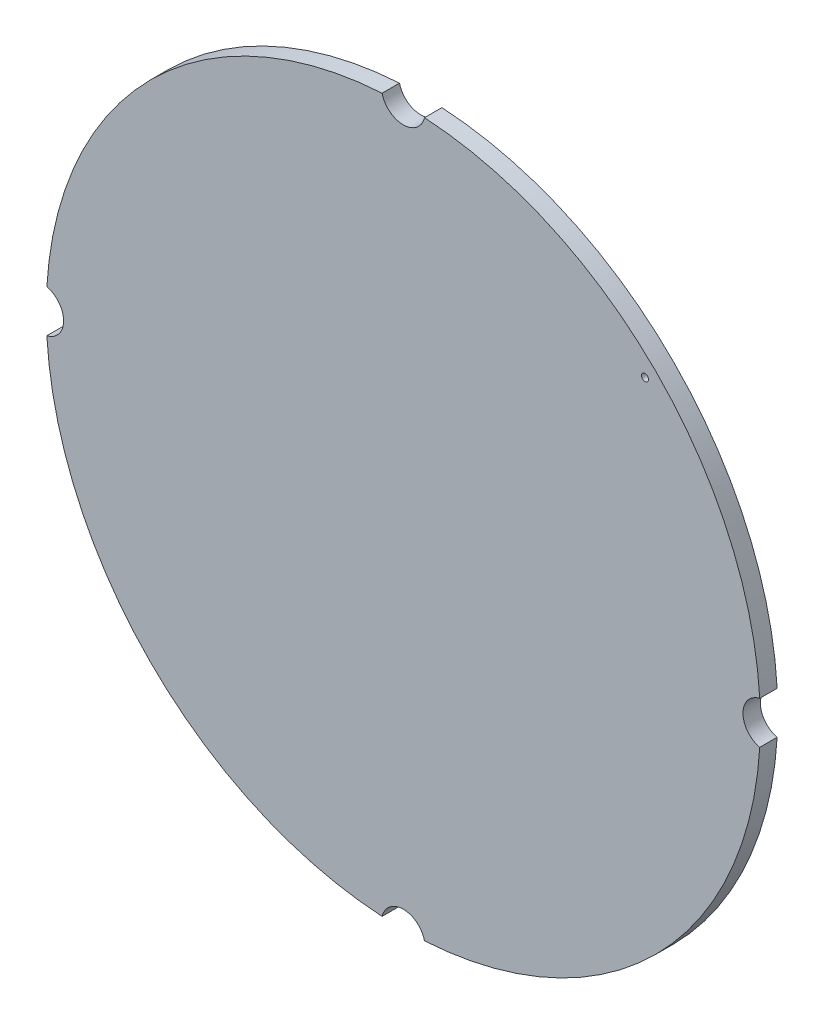
ISO-10303-21;
HEADER;
FILE_DESCRIPTION(('STEP AP214'),'2;1');
FILE_NAME('part.step','',(''),(''),'','','');
FILE_SCHEMA(('AUTOMOTIVE_DESIGN { 1 0 10303 214 1 1 1 1 }'));
ENDSEC;
DATA;
#1=APPLICATION_CONTEXT('core data for automotive mechanical design processes');
#2=APPLICATION_PROTOCOL_DEFINITION('international standard','automotive_design',2000,#1);
#3=PRODUCT_CONTEXT('',#1,'mechanical');
#4=PRODUCT('Part','Part','',(#3));
#5=PRODUCT_RELATED_PRODUCT_CATEGORY('part','',(#4));
#6=PRODUCT_DEFINITION_FORMATION('','',#4);
#7=PRODUCT_DEFINITION_CONTEXT('part definition',#1,'design');
#8=PRODUCT_DEFINITION('design','',#6,#7);
#9=PRODUCT_DEFINITION_SHAPE('','',#8);
#10=(LENGTH_UNIT() NAMED_UNIT(*) SI_UNIT(.MILLI.,.METRE.));
#11=(NAMED_UNIT(*) PLANE_ANGLE_UNIT() SI_UNIT($,.RADIAN.));
#12=(NAMED_UNIT(*) SI_UNIT($,.STERADIAN.) SOLID_ANGLE_UNIT());
#13=UNCERTAINTY_MEASURE_WITH_UNIT(LENGTH_MEASURE(1.E-05),#10,'distance_accuracy_value','');
#14=(GEOMETRIC_REPRESENTATION_CONTEXT(3) GLOBAL_UNCERTAINTY_ASSIGNED_CONTEXT((#13)) GLOBAL_UNIT_ASSIGNED_CONTEXT((#10,
#11,#12)) REPRESENTATION_CONTEXT('',''));
#15=CARTESIAN_POINT('',(0.,0.,0.));
#16=DIRECTION('',(0.,0.,1.));
#17=DIRECTION('',(1.,0.,0.));
#18=AXIS2_PLACEMENT_3D('',#15,#16,#17);
#19=CARTESIAN_POINT('',(0.,0.,3.));
#20=DIRECTION('',(0.,0.,-1.));
#21=DIRECTION('',(-1.,0.,0.));
#22=AXIS2_PLACEMENT_3D('',#19,#20,#21);
#23=CYLINDRICAL_SURFACE('',#22,82.);
#24=CARTESIAN_POINT('',(0.,0.,0.));
#25=DIRECTION('',(0.,0.,1.));
#26=DIRECTION('',(1.,0.,0.));
#27=AXIS2_PLACEMENT_3D('',#24,#25,#26);
#28=CIRCLE('',#27,82.);
#29=CARTESIAN_POINT('',(-4.86723129559619,81.855421686747,0.));
#30=VERTEX_POINT('',#29);
#31=CARTESIAN_POINT('',(-81.8554216867469,4.86723129559704,0.));
#32=VERTEX_POINT('',#31);
#33=EDGE_CURVE('E11',#30,#32,#28,.T.);
#34=ORIENTED_EDGE('',*,*,#33,.T.);
#35=DIRECTION('',(0.,0.,-1.));
#36=VECTOR('',#35,1.);
#37=CARTESIAN_POINT('',(-81.8554216867469,4.86723129559704,2.));
#38=LINE('',#37,#36);
#39=CARTESIAN_POINT('',(-81.8554216867469,4.86723129559704,4.));
#40=VERTEX_POINT('',#39);
#41=EDGE_CURVE('E102',#32,#40,#38,.F.);
#42=ORIENTED_EDGE('',*,*,#41,.T.);
#43=CARTESIAN_POINT('',(0.,0.,4.));
#44=DIRECTION('',(0.,0.,1.));
#45=DIRECTION('',(1.,0.,0.));
#46=AXIS2_PLACEMENT_3D('',#43,#44,#45);
#47=CIRCLE('',#46,82.);
#48=CARTESIAN_POINT('',(-4.86723129559619,81.855421686747,4.));
#49=VERTEX_POINT('',#48);
#50=EDGE_CURVE('E112',#49,#40,#47,.T.);
#51=ORIENTED_EDGE('',*,*,#50,.F.);
#52=DIRECTION('',(0.,0.,-1.));
#53=VECTOR('',#52,1.);
#54=CARTESIAN_POINT('',(-4.86723129559619,81.855421686747,2.));
#55=LINE('',#54,#53);
#56=EDGE_CURVE('E133',#49,#30,#55,.T.);
#57=ORIENTED_EDGE('',*,*,#56,.T.);
#58=EDGE_LOOP('',(#34,#42,#51,#57));
#59=FACE_BOUND('',#58,.T.);
#60=ADVANCED_FACE('F35',(#59),#23,.T.);
#61=CARTESIAN_POINT('',(-81.8554216867471,-4.86723129559533,4.));
#62=VERTEX_POINT('',#61);
#63=CARTESIAN_POINT('',(-4.86723129559619,-81.855421686747,4.));
#64=VERTEX_POINT('',#63);
#65=EDGE_CURVE('E121',#62,#64,#47,.T.);
#66=ORIENTED_EDGE('',*,*,#65,.F.);
#67=DIRECTION('',(0.,0.,-1.));
#68=VECTOR('',#67,1.);
#69=CARTESIAN_POINT('',(-81.8554216867471,-4.86723129559533,2.));
#70=LINE('',#69,#68);
#71=CARTESIAN_POINT('',(-81.8554216867471,-4.86723129559533,0.));
#72=VERTEX_POINT('',#71);
#73=EDGE_CURVE('E51',#62,#72,#70,.T.);
#74=ORIENTED_EDGE('',*,*,#73,.T.);
#75=CARTESIAN_POINT('',(-4.86723129559619,-81.855421686747,0.));
#76=VERTEX_POINT('',#75);
#77=EDGE_CURVE('E43',#72,#76,#28,.T.);
#78=ORIENTED_EDGE('',*,*,#77,.T.);
#79=DIRECTION('',(0.,0.,-1.));
#80=VECTOR('',#79,1.);
#81=CARTESIAN_POINT('',(-4.86723129559619,-81.855421686747,2.));
#82=LINE('',#81,#80);
#83=EDGE_CURVE('E150',#76,#64,#82,.F.);
#84=ORIENTED_EDGE('',*,*,#83,.T.);
#85=EDGE_LOOP('',(#66,#74,#78,#84));
#86=FACE_BOUND('',#85,.T.);
#87=ADVANCED_FACE('F186',(#86),#23,.T.);
#88=CARTESIAN_POINT('',(4.86723129559619,-81.855421686747,4.));
#89=VERTEX_POINT('',#88);
#90=CARTESIAN_POINT('',(81.855421686747,-4.86723129559647,4.));
#91=VERTEX_POINT('',#90);
#92=EDGE_CURVE('E127',#89,#91,#47,.T.);
#93=ORIENTED_EDGE('',*,*,#92,.F.);
#94=DIRECTION('',(0.,0.,-1.));
#95=VECTOR('',#94,1.);
#96=CARTESIAN_POINT('',(4.86723129559619,-81.855421686747,2.));
#97=LINE('',#96,#95);
#98=CARTESIAN_POINT('',(4.86723129559619,-81.855421686747,0.));
#99=VERTEX_POINT('',#98);
#100=EDGE_CURVE('E59',#89,#99,#97,.T.);
#101=ORIENTED_EDGE('',*,*,#100,.T.);
#102=CARTESIAN_POINT('',(81.855421686747,-4.86723129559647,0.));
#103=VERTEX_POINT('',#102);
#104=EDGE_CURVE('E216',#99,#103,#28,.T.);
#105=ORIENTED_EDGE('',*,*,#104,.T.);
#106=DIRECTION('',(0.,0.,-1.));
#107=VECTOR('',#106,1.);
#108=CARTESIAN_POINT('',(81.855421686747,-4.86723129559647,2.));
#109=LINE('',#108,#107);
#110=EDGE_CURVE('E140',#103,#91,#109,.F.);
#111=ORIENTED_EDGE('',*,*,#110,.T.);
#112=EDGE_LOOP('',(#93,#101,#105,#111));
#113=FACE_BOUND('',#112,.T.);
#114=ADVANCED_FACE('F190',(#113),#23,.T.);
#115=CARTESIAN_POINT('',(0.,0.,0.));
#116=DIRECTION('',(0.,0.,1.));
#117=DIRECTION('',(1.,0.,0.));
#118=AXIS2_PLACEMENT_3D('',#115,#116,#117);
#119=PLANE('',#118);
#120=CARTESIAN_POINT('',(55.507882323144,55.507882323144,0.));
#121=DIRECTION('',(0.,0.,1.));
#122=DIRECTION('',(1.,0.,0.));
#123=AXIS2_PLACEMENT_3D('',#120,#121,#122);
#124=CIRCLE('',#123,0.800000000000002);
#125=CARTESIAN_POINT('',(56.307882323144,55.507882323144,0.));
#126=VERTEX_POINT('',#125);
#127=EDGE_CURVE('E159',#126,#126,#124,.T.);
#128=ORIENTED_EDGE('',*,*,#127,.T.);
#129=EDGE_LOOP('',(#128));
#130=FACE_BOUND('',#129,.T.);
#131=ORIENTED_EDGE('',*,*,#77,.F.);
#132=CARTESIAN_POINT('',(-83.,8.6937885337194E-13,0.));
#133=DIRECTION('',(0.,0.,-1.));
#134=DIRECTION('',(0.,-1.,0.));
#135=AXIS2_PLACEMENT_3D('',#132,#133,#134);
#136=CIRCLE('',#135,5.);
#137=EDGE_CURVE('E107',#32,#72,#136,.T.);
#138=ORIENTED_EDGE('',*,*,#137,.F.);
#139=ORIENTED_EDGE('',*,*,#33,.F.);
#140=CARTESIAN_POINT('',(0.,83.,0.));
#141=DIRECTION('',(0.,0.,-1.));
#142=DIRECTION('',(-1.,0.,0.));
#143=AXIS2_PLACEMENT_3D('',#140,#141,#142);
#144=CIRCLE('',#143,5.);
#145=CARTESIAN_POINT('',(4.86723129559619,81.855421686747,0.));
#146=VERTEX_POINT('',#145);
#147=EDGE_CURVE('E138',#146,#30,#144,.T.);
#148=ORIENTED_EDGE('',*,*,#147,.F.);
#149=CARTESIAN_POINT('',(81.855421686747,4.8672312955959,0.));
#150=VERTEX_POINT('',#149);
#151=EDGE_CURVE('E44',#150,#146,#28,.T.);
#152=ORIENTED_EDGE('',*,*,#151,.F.);
#153=CARTESIAN_POINT('',(83.,-2.8979295112398E-13,0.));
#154=DIRECTION('',(0.,0.,-1.));
#155=DIRECTION('',(0.,1.,0.));
#156=AXIS2_PLACEMENT_3D('',#153,#154,#155);
#157=CIRCLE('',#156,5.);
#158=EDGE_CURVE('E148',#103,#150,#157,.T.);
#159=ORIENTED_EDGE('',*,*,#158,.F.);
#160=ORIENTED_EDGE('',*,*,#104,.F.);
#161=CARTESIAN_POINT('',(0.,-83.,0.));
#162=DIRECTION('',(0.,0.,-1.));
#163=DIRECTION('',(1.,0.,0.));
#164=AXIS2_PLACEMENT_3D('',#161,#162,#163);
#165=CIRCLE('',#164,5.);
#166=EDGE_CURVE('E114',#76,#99,#165,.T.);
#167=ORIENTED_EDGE('',*,*,#166,.F.);
#168=EDGE_LOOP('',(#131,#138,#139,#148,#152,#159,#160,#167));
#169=FACE_BOUND('',#168,.T.);
#170=CARTESIAN_POINT('',(0.,0.,0.));
#171=DIRECTION('',(0.,0.,1.));
#172=DIRECTION('',(1.,0.,0.));
#173=AXIS2_PLACEMENT_3D('',#170,#171,#172);
#174=CIRCLE('',#173,75.);
#175=CARTESIAN_POINT('',(75.,0.,0.));
#176=VERTEX_POINT('',#175);
#177=EDGE_CURVE('E125',#176,#176,#174,.T.);
#178=ORIENTED_EDGE('',*,*,#177,.T.);
#179=EDGE_LOOP('',(#178));
#180=FACE_BOUND('',#179,.T.);
#181=ADVANCED_FACE('F193',(#130,#169,#180),#119,.F.);
#182=CARTESIAN_POINT('',(81.855421686747,4.86723129559591,4.));
#183=VERTEX_POINT('',#182);
#184=CARTESIAN_POINT('',(4.86723129559619,81.855421686747,4.));
#185=VERTEX_POINT('',#184);
#186=EDGE_CURVE('E123',#183,#185,#47,.T.);
#187=ORIENTED_EDGE('',*,*,#186,.F.);
#188=DIRECTION('',(0.,0.,-1.));
#189=VECTOR('',#188,1.);
#190=CARTESIAN_POINT('',(81.855421686747,4.8672312955959,2.));
#191=LINE('',#190,#189);
#192=EDGE_CURVE('E144',#183,#150,#191,.T.);
#193=ORIENTED_EDGE('',*,*,#192,.T.);
#194=ORIENTED_EDGE('',*,*,#151,.T.);
#195=DIRECTION('',(0.,0.,-1.));
#196=VECTOR('',#195,1.);
#197=CARTESIAN_POINT('',(4.86723129559619,81.855421686747,2.));
#198=LINE('',#197,#196);
#199=EDGE_CURVE('E129',#146,#185,#198,.F.);
#200=ORIENTED_EDGE('',*,*,#199,.T.);
#201=EDGE_LOOP('',(#187,#193,#194,#200));
#202=FACE_BOUND('',#201,.T.);
#203=ADVANCED_FACE('F37',(#202),#23,.T.);
#204=CARTESIAN_POINT('',(0.,0.,3.));
#205=DIRECTION('',(0.,0.,-1.));
#206=DIRECTION('',(-1.,0.,0.));
#207=AXIS2_PLACEMENT_3D('',#204,#205,#206);
#208=CYLINDRICAL_SURFACE('',#207,75.);
#209=CARTESIAN_POINT('',(0.,0.,3.));
#210=DIRECTION('',(0.,0.,1.));
#211=DIRECTION('',(1.,0.,0.));
#212=AXIS2_PLACEMENT_3D('',#209,#210,#211);
#213=CIRCLE('',#212,75.);
#214=CARTESIAN_POINT('',(75.,0.,3.));
#215=VERTEX_POINT('',#214);
#216=EDGE_CURVE('E120',#215,#215,#213,.T.);
#217=ORIENTED_EDGE('',*,*,#216,.T.);
#218=EDGE_LOOP('',(#217));
#219=FACE_BOUND('',#218,.T.);
#220=ORIENTED_EDGE('',*,*,#177,.F.);
#221=EDGE_LOOP('',(#220));
#222=FACE_BOUND('',#221,.T.);
#223=ADVANCED_FACE('F182',(#219,#222),#208,.F.);
#224=CARTESIAN_POINT('',(0.,0.,3.));
#225=DIRECTION('',(0.,0.,1.));
#226=DIRECTION('',(1.,0.,0.));
#227=AXIS2_PLACEMENT_3D('',#224,#225,#226);
#228=PLANE('',#227);
#229=ORIENTED_EDGE('',*,*,#216,.F.);
#230=EDGE_LOOP('',(#229));
#231=FACE_BOUND('',#230,.T.);
#232=ADVANCED_FACE('F171',(#231),#228,.F.);
#233=CARTESIAN_POINT('',(0.,0.,4.));
#234=DIRECTION('',(0.,0.,1.));
#235=DIRECTION('',(1.,0.,0.));
#236=AXIS2_PLACEMENT_3D('',#233,#234,#235);
#237=PLANE('',#236);
#238=CARTESIAN_POINT('',(55.507882323144,55.507882323144,4.));
#239=DIRECTION('',(0.,0.,1.));
#240=DIRECTION('',(1.,0.,0.));
#241=AXIS2_PLACEMENT_3D('',#238,#239,#240);
#242=CIRCLE('',#241,0.799999999999988);
#243=CARTESIAN_POINT('',(56.307882323144,55.507882323144,4.));
#244=VERTEX_POINT('',#243);
#245=EDGE_CURVE('E163',#244,#244,#242,.T.);
#246=ORIENTED_EDGE('',*,*,#245,.F.);
#247=EDGE_LOOP('',(#246));
#248=FACE_BOUND('',#247,.T.);
#249=CARTESIAN_POINT('',(-83.,8.6937885337194E-13,4.));
#250=DIRECTION('',(0.,0.,-1.));
#251=DIRECTION('',(0.,-1.,0.));
#252=AXIS2_PLACEMENT_3D('',#249,#250,#251);
#253=CIRCLE('',#252,5.);
#254=EDGE_CURVE('E99',#40,#62,#253,.T.);
#255=ORIENTED_EDGE('',*,*,#254,.T.);
#256=ORIENTED_EDGE('',*,*,#65,.T.);
#257=CARTESIAN_POINT('',(0.,-83.,4.));
#258=DIRECTION('',(0.,0.,-1.));
#259=DIRECTION('',(1.,0.,0.));
#260=AXIS2_PLACEMENT_3D('',#257,#258,#259);
#261=CIRCLE('',#260,5.);
#262=EDGE_CURVE('E155',#64,#89,#261,.T.);
#263=ORIENTED_EDGE('',*,*,#262,.T.);
#264=ORIENTED_EDGE('',*,*,#92,.T.);
#265=CARTESIAN_POINT('',(83.,-2.8979295112398E-13,4.));
#266=DIRECTION('',(0.,0.,-1.));
#267=DIRECTION('',(0.,1.,0.));
#268=AXIS2_PLACEMENT_3D('',#265,#266,#267);
#269=CIRCLE('',#268,5.);
#270=EDGE_CURVE('E147',#91,#183,#269,.T.);
#271=ORIENTED_EDGE('',*,*,#270,.T.);
#272=ORIENTED_EDGE('',*,*,#186,.T.);
#273=CARTESIAN_POINT('',(0.,83.,4.));
#274=DIRECTION('',(0.,0.,-1.));
#275=DIRECTION('',(-1.,0.,0.));
#276=AXIS2_PLACEMENT_3D('',#273,#274,#275);
#277=CIRCLE('',#276,5.);
#278=EDGE_CURVE('E119',#185,#49,#277,.T.);
#279=ORIENTED_EDGE('',*,*,#278,.T.);
#280=ORIENTED_EDGE('',*,*,#50,.T.);
#281=EDGE_LOOP('',(#255,#256,#263,#264,#271,#272,#279,#280));
#282=FACE_BOUND('',#281,.T.);
#283=ADVANCED_FACE('F117',(#248,#282),#237,.T.);
#284=CARTESIAN_POINT('',(0.,83.,4.));
#285=DIRECTION('',(0.,0.,-1.));
#286=DIRECTION('',(-1.,0.,0.));
#287=AXIS2_PLACEMENT_3D('',#284,#285,#286);
#288=CYLINDRICAL_SURFACE('',#287,5.);
#289=ORIENTED_EDGE('',*,*,#147,.T.);
#290=ORIENTED_EDGE('',*,*,#56,.F.);
#291=ORIENTED_EDGE('',*,*,#278,.F.);
#292=ORIENTED_EDGE('',*,*,#199,.F.);
#293=EDGE_LOOP('',(#289,#290,#291,#292));
#294=FACE_BOUND('',#293,.T.);
#295=ADVANCED_FACE('F170',(#294),#288,.F.);
#296=CARTESIAN_POINT('',(83.,-2.8979295112398E-13,4.));
#297=DIRECTION('',(0.,0.,-1.));
#298=DIRECTION('',(-1.,0.,0.));
#299=AXIS2_PLACEMENT_3D('',#296,#297,#298);
#300=CYLINDRICAL_SURFACE('',#299,5.);
#301=ORIENTED_EDGE('',*,*,#158,.T.);
#302=ORIENTED_EDGE('',*,*,#192,.F.);
#303=ORIENTED_EDGE('',*,*,#270,.F.);
#304=ORIENTED_EDGE('',*,*,#110,.F.);
#305=EDGE_LOOP('',(#301,#302,#303,#304));
#306=FACE_BOUND('',#305,.T.);
#307=ADVANCED_FACE('F178',(#306),#300,.F.);
#308=CARTESIAN_POINT('',(0.,-83.,4.));
#309=DIRECTION('',(0.,0.,-1.));
#310=DIRECTION('',(-1.,0.,0.));
#311=AXIS2_PLACEMENT_3D('',#308,#309,#310);
#312=CYLINDRICAL_SURFACE('',#311,5.);
#313=ORIENTED_EDGE('',*,*,#166,.T.);
#314=ORIENTED_EDGE('',*,*,#100,.F.);
#315=ORIENTED_EDGE('',*,*,#262,.F.);
#316=ORIENTED_EDGE('',*,*,#83,.F.);
#317=EDGE_LOOP('',(#313,#314,#315,#316));
#318=FACE_BOUND('',#317,.T.);
#319=ADVANCED_FACE('F222',(#318),#312,.F.);
#320=CARTESIAN_POINT('',(-83.,8.6937885337194E-13,4.));
#321=DIRECTION('',(0.,0.,-1.));
#322=DIRECTION('',(-1.,0.,0.));
#323=AXIS2_PLACEMENT_3D('',#320,#321,#322);
#324=CYLINDRICAL_SURFACE('',#323,5.);
#325=ORIENTED_EDGE('',*,*,#137,.T.);
#326=ORIENTED_EDGE('',*,*,#73,.F.);
#327=ORIENTED_EDGE('',*,*,#254,.F.);
#328=ORIENTED_EDGE('',*,*,#41,.F.);
#329=EDGE_LOOP('',(#325,#326,#327,#328));
#330=FACE_BOUND('',#329,.T.);
#331=ADVANCED_FACE('F101',(#330),#324,.F.);
#332=CARTESIAN_POINT('',(55.507882323144,55.507882323144,4.));
#333=DIRECTION('',(0.,0.,1.));
#334=DIRECTION('',(1.,0.,0.));
#335=AXIS2_PLACEMENT_3D('',#332,#333,#334);
#336=CYLINDRICAL_SURFACE('',#335,0.799999999999995);
#337=ORIENTED_EDGE('',*,*,#127,.F.);
#338=EDGE_LOOP('',(#337));
#339=FACE_BOUND('',#338,.T.);
#340=ORIENTED_EDGE('',*,*,#245,.T.);
#341=EDGE_LOOP('',(#340));
#342=FACE_BOUND('',#341,.T.);
#343=ADVANCED_FACE('F167',(#339,#342),#336,.F.);
#344=CLOSED_SHELL('',(#60,#87,#114,#181,#203,#223,#232,#283,#295,#307,#319,#331,#343));
#345=MANIFOLD_SOLID_BREP('B2',#344);
#346=ADVANCED_BREP_SHAPE_REPRESENTATION('',(#18,#345),#14);
#347=SHAPE_DEFINITION_REPRESENTATION(#9,#346);
ENDSEC;
END-ISO-10303-21;
